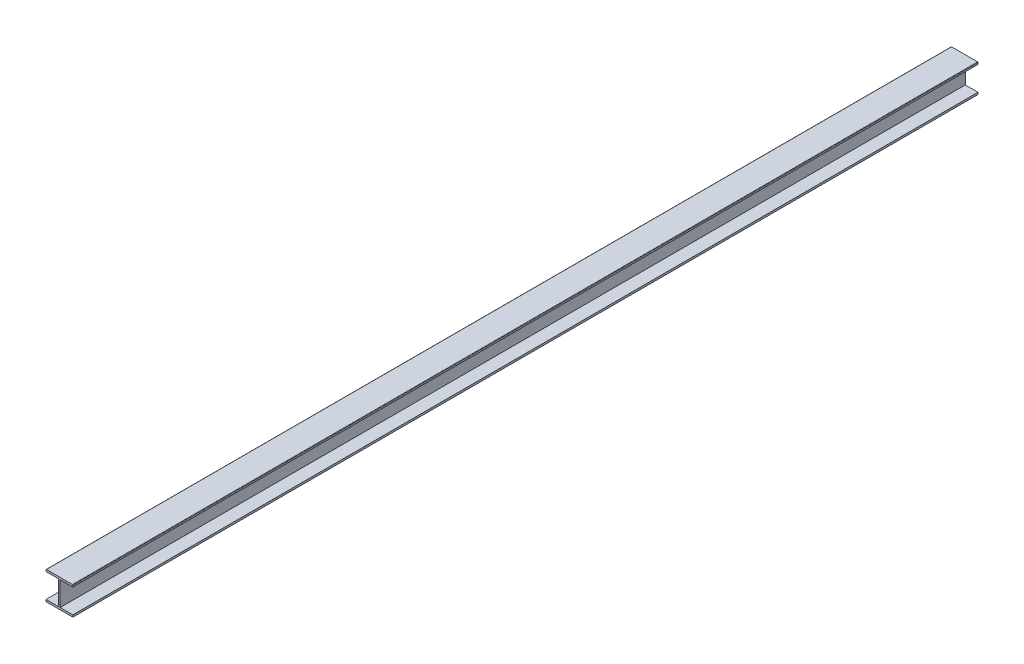
ISO-10303-21;
HEADER;
FILE_DESCRIPTION(('STEP AP214'),'2;1');
FILE_NAME('part.step','',(''),(''),'','','');
FILE_SCHEMA(('AUTOMOTIVE_DESIGN { 1 0 10303 214 1 1 1 1 }'));
ENDSEC;
DATA;
#1=APPLICATION_CONTEXT('core data for automotive mechanical design processes');
#2=APPLICATION_PROTOCOL_DEFINITION('international standard','automotive_design',2000,#1);
#3=PRODUCT_CONTEXT('',#1,'mechanical');
#4=PRODUCT('Part','Part','',(#3));
#5=PRODUCT_RELATED_PRODUCT_CATEGORY('part','',(#4));
#6=PRODUCT_DEFINITION_FORMATION('','',#4);
#7=PRODUCT_DEFINITION_CONTEXT('part definition',#1,'design');
#8=PRODUCT_DEFINITION('design','',#6,#7);
#9=PRODUCT_DEFINITION_SHAPE('','',#8);
#10=(LENGTH_UNIT() NAMED_UNIT(*) SI_UNIT(.MILLI.,.METRE.));
#11=(NAMED_UNIT(*) PLANE_ANGLE_UNIT() SI_UNIT($,.RADIAN.));
#12=(NAMED_UNIT(*) SI_UNIT($,.STERADIAN.) SOLID_ANGLE_UNIT());
#13=UNCERTAINTY_MEASURE_WITH_UNIT(LENGTH_MEASURE(1.E-05),#10,'distance_accuracy_value','');
#14=(GEOMETRIC_REPRESENTATION_CONTEXT(3) GLOBAL_UNCERTAINTY_ASSIGNED_CONTEXT((#13)) GLOBAL_UNIT_ASSIGNED_CONTEXT((#10,
#11,#12)) REPRESENTATION_CONTEXT('',''));
#15=CARTESIAN_POINT('',(0.,0.,0.));
#16=DIRECTION('',(0.,0.,1.));
#17=DIRECTION('',(1.,0.,0.));
#18=AXIS2_PLACEMENT_3D('',#15,#16,#17);
#19=CARTESIAN_POINT('',(154.432,-162.052240532958,5214.4));
#20=DIRECTION('',(0.,1.,0.));
#21=DIRECTION('',(-1.,0.,0.));
#22=AXIS2_PLACEMENT_3D('',#19,#20,#21);
#23=PLANE('',#22);
#24=DIRECTION('',(-1.,0.,0.));
#25=VECTOR('',#24,1.);
#26=CARTESIAN_POINT('',(154.432000000005,-162.052240532958,304.8));
#27=LINE('',#26,#25);
#28=CARTESIAN_POINT('',(154.432,-162.052240532958,304.800000000002));
#29=VERTEX_POINT('',#28);
#30=CARTESIAN_POINT('',(0.,-162.052240532958,304.800000000002));
#31=VERTEX_POINT('',#30);
#32=EDGE_CURVE('E207',#29,#31,#27,.T.);
#33=ORIENTED_EDGE('',*,*,#32,.F.);
#34=DIRECTION('',(0.,0.,-1.));
#35=VECTOR('',#34,1.);
#36=CARTESIAN_POINT('',(154.432,-162.052240532958,5214.4));
#37=LINE('',#36,#35);
#38=CARTESIAN_POINT('',(154.432,-162.052240532958,2454.8));
#39=VERTEX_POINT('',#38);
#40=EDGE_CURVE('E340',#39,#29,#37,.T.);
#41=ORIENTED_EDGE('',*,*,#40,.F.);
#42=DIRECTION('',(1.,0.,0.));
#43=VECTOR('',#42,1.);
#44=CARTESIAN_POINT('',(154.432,-162.052240532958,2454.8));
#45=LINE('',#44,#43);
#46=CARTESIAN_POINT('',(0.,-162.052240532958,2454.8));
#47=VERTEX_POINT('',#46);
#48=EDGE_CURVE('E192',#47,#39,#45,.T.);
#49=ORIENTED_EDGE('',*,*,#48,.F.);
#50=DIRECTION('',(0.,0.,-1.));
#51=VECTOR('',#50,1.);
#52=CARTESIAN_POINT('',(0.,-162.052240532958,5214.4));
#53=LINE('',#52,#51);
#54=EDGE_CURVE('E347',#47,#31,#53,.T.);
#55=ORIENTED_EDGE('',*,*,#54,.T.);
#56=EDGE_LOOP('',(#33,#41,#49,#55));
#57=FACE_BOUND('',#56,.T.);
#58=ADVANCED_FACE('F41',(#57),#23,.F.);
#59=DIRECTION('',(1.,0.,0.));
#60=VECTOR('',#59,1.);
#61=CARTESIAN_POINT('',(154.432,-162.052240532958,4909.6));
#62=LINE('',#61,#60);
#63=CARTESIAN_POINT('',(0.,-162.052240532958,4909.6));
#64=VERTEX_POINT('',#63);
#65=CARTESIAN_POINT('',(154.432,-162.052240532958,4909.6));
#66=VERTEX_POINT('',#65);
#67=EDGE_CURVE('E204',#64,#66,#62,.T.);
#68=ORIENTED_EDGE('',*,*,#67,.F.);
#69=CARTESIAN_POINT('',(0.,-162.052240532958,2759.6));
#70=VERTEX_POINT('',#69);
#71=EDGE_CURVE('E270',#64,#70,#53,.T.);
#72=ORIENTED_EDGE('',*,*,#71,.T.);
#73=DIRECTION('',(-1.,0.,0.));
#74=VECTOR('',#73,1.);
#75=CARTESIAN_POINT('',(154.432,-162.052240532958,2759.6));
#76=LINE('',#75,#74);
#77=CARTESIAN_POINT('',(154.432,-162.052240532958,2759.6));
#78=VERTEX_POINT('',#77);
#79=EDGE_CURVE('E195',#78,#70,#76,.T.);
#80=ORIENTED_EDGE('',*,*,#79,.F.);
#81=EDGE_CURVE('E264',#66,#78,#37,.T.);
#82=ORIENTED_EDGE('',*,*,#81,.F.);
#83=EDGE_LOOP('',(#68,#72,#80,#82));
#84=FACE_BOUND('',#83,.T.);
#85=ADVANCED_FACE('F361',(#84),#23,.F.);
#86=CARTESIAN_POINT('',(0.,-162.052240532958,5214.4));
#87=VERTEX_POINT('',#86);
#88=EDGE_CURVE('E266',#87,#64,#53,.T.);
#89=ORIENTED_EDGE('',*,*,#88,.T.);
#90=ORIENTED_EDGE('',*,*,#67,.T.);
#91=CARTESIAN_POINT('',(154.432,-162.052240532958,5214.4));
#92=VERTEX_POINT('',#91);
#93=EDGE_CURVE('E260',#92,#66,#37,.T.);
#94=ORIENTED_EDGE('',*,*,#93,.F.);
#95=DIRECTION('',(1.,0.,0.));
#96=VECTOR('',#95,1.);
#97=CARTESIAN_POINT('',(154.432,-162.052240532958,5214.4));
#98=LINE('',#97,#96);
#99=EDGE_CURVE('E325',#87,#92,#98,.T.);
#100=ORIENTED_EDGE('',*,*,#99,.F.);
#101=EDGE_LOOP('',(#89,#90,#94,#100));
#102=FACE_BOUND('',#101,.T.);
#103=ADVANCED_FACE('F355',(#102),#23,.F.);
#104=CARTESIAN_POINT('',(154.432,-162.052240532958,0.));
#105=VERTEX_POINT('',#104);
#106=EDGE_CURVE('E259',#29,#105,#37,.T.);
#107=ORIENTED_EDGE('',*,*,#106,.F.);
#108=ORIENTED_EDGE('',*,*,#32,.T.);
#109=CARTESIAN_POINT('',(0.,-162.052240532958,0.));
#110=VERTEX_POINT('',#109);
#111=EDGE_CURVE('E263',#31,#110,#53,.T.);
#112=ORIENTED_EDGE('',*,*,#111,.T.);
#113=DIRECTION('',(1.,0.,0.));
#114=VECTOR('',#113,1.);
#115=CARTESIAN_POINT('',(154.432,-162.052240532958,0.));
#116=LINE('',#115,#114);
#117=EDGE_CURVE('E290',#110,#105,#116,.T.);
#118=ORIENTED_EDGE('',*,*,#117,.T.);
#119=EDGE_LOOP('',(#107,#108,#112,#118));
#120=FACE_BOUND('',#119,.T.);
#121=ADVANCED_FACE('F342',(#120),#23,.F.);
#122=CARTESIAN_POINT('',(0.,-11.5572405329582,5214.4));
#123=DIRECTION('',(1.,0.,0.));
#124=DIRECTION('',(0.,0.,-1.));
#125=AXIS2_PLACEMENT_3D('',#122,#123,#124);
#126=PLANE('',#125);
#127=DIRECTION('',(0.,-1.,0.));
#128=VECTOR('',#127,1.);
#129=CARTESIAN_POINT('',(0.,-11.5572405329582,5214.4));
#130=LINE('',#129,#128);
#131=CARTESIAN_POINT('',(0.,-2.54024053295815,5214.4));
#132=VERTEX_POINT('',#131);
#133=CARTESIAN_POINT('',(0.,-11.5572405329582,5214.4));
#134=VERTEX_POINT('',#133);
#135=EDGE_CURVE('E169',#132,#134,#130,.T.);
#136=ORIENTED_EDGE('',*,*,#135,.F.);
#137=DIRECTION('',(0.,0.,-1.));
#138=VECTOR('',#137,1.);
#139=CARTESIAN_POINT('',(0.,-2.54024053295815,5214.4));
#140=LINE('',#139,#138);
#141=CARTESIAN_POINT('',(0.,-2.54024053295815,0.));
#142=VERTEX_POINT('',#141);
#143=EDGE_CURVE('E11',#132,#142,#140,.T.);
#144=ORIENTED_EDGE('',*,*,#143,.T.);
#145=DIRECTION('',(0.,-1.,0.));
#146=VECTOR('',#145,1.);
#147=CARTESIAN_POINT('',(0.,-11.5572405329582,0.));
#148=LINE('',#147,#146);
#149=CARTESIAN_POINT('',(0.,-11.5572405329582,0.));
#150=VERTEX_POINT('',#149);
#151=EDGE_CURVE('E190',#142,#150,#148,.T.);
#152=ORIENTED_EDGE('',*,*,#151,.T.);
#153=DIRECTION('',(0.,0.,-1.));
#154=VECTOR('',#153,1.);
#155=CARTESIAN_POINT('',(0.,-11.5572405329582,5214.4));
#156=LINE('',#155,#154);
#157=EDGE_CURVE('E182',#134,#150,#156,.T.);
#158=ORIENTED_EDGE('',*,*,#157,.F.);
#159=EDGE_LOOP('',(#136,#144,#152,#158));
#160=FACE_BOUND('',#159,.T.);
#161=ADVANCED_FACE('F188',(#160),#126,.F.);
#162=CARTESIAN_POINT('',(73.152,-11.5572405329581,5214.4));
#163=DIRECTION('',(0.,1.,0.));
#164=DIRECTION('',(-1.,0.,0.));
#165=AXIS2_PLACEMENT_3D('',#162,#163,#164);
#166=PLANE('',#165);
#167=DIRECTION('',(1.,0.,0.));
#168=VECTOR('',#167,1.);
#169=CARTESIAN_POINT('',(73.152,-11.5572405329581,0.));
#170=LINE('',#169,#168);
#171=CARTESIAN_POINT('',(73.152,-11.5572405329581,0.));
#172=VERTEX_POINT('',#171);
#173=EDGE_CURVE('E292',#150,#172,#170,.T.);
#174=ORIENTED_EDGE('',*,*,#173,.T.);
#175=DIRECTION('',(0.,0.,-1.));
#176=VECTOR('',#175,1.);
#177=CARTESIAN_POINT('',(73.152,-11.5572405329581,5214.4));
#178=LINE('',#177,#176);
#179=CARTESIAN_POINT('',(73.152,-11.5572405329581,5214.4));
#180=VERTEX_POINT('',#179);
#181=EDGE_CURVE('E184',#180,#172,#178,.T.);
#182=ORIENTED_EDGE('',*,*,#181,.F.);
#183=DIRECTION('',(1.,0.,0.));
#184=VECTOR('',#183,1.);
#185=CARTESIAN_POINT('',(73.152,-11.5572405329581,5214.4));
#186=LINE('',#185,#184);
#187=EDGE_CURVE('E172',#134,#180,#186,.T.);
#188=ORIENTED_EDGE('',*,*,#187,.F.);
#189=ORIENTED_EDGE('',*,*,#157,.T.);
#190=EDGE_LOOP('',(#174,#182,#188,#189));
#191=FACE_BOUND('',#190,.T.);
#192=ADVANCED_FACE('F181',(#191),#166,.F.);
#193=CARTESIAN_POINT('',(73.152,-150.495240532958,5214.4));
#194=DIRECTION('',(1.,0.,0.));
#195=DIRECTION('',(0.,0.,-1.));
#196=AXIS2_PLACEMENT_3D('',#193,#194,#195);
#197=PLANE('',#196);
#198=DIRECTION('',(0.,-1.,0.));
#199=VECTOR('',#198,1.);
#200=CARTESIAN_POINT('',(73.152,-150.495240532958,0.));
#201=LINE('',#200,#199);
#202=CARTESIAN_POINT('',(73.152,-150.495240532958,0.));
#203=VERTEX_POINT('',#202);
#204=EDGE_CURVE('E285',#172,#203,#201,.T.);
#205=ORIENTED_EDGE('',*,*,#204,.T.);
#206=DIRECTION('',(0.,0.,-1.));
#207=VECTOR('',#206,1.);
#208=CARTESIAN_POINT('',(73.152,-150.495240532958,5214.4));
#209=LINE('',#208,#207);
#210=CARTESIAN_POINT('',(73.152,-150.495240532958,5214.4));
#211=VERTEX_POINT('',#210);
#212=EDGE_CURVE('E197',#211,#203,#209,.T.);
#213=ORIENTED_EDGE('',*,*,#212,.F.);
#214=DIRECTION('',(0.,-1.,0.));
#215=VECTOR('',#214,1.);
#216=CARTESIAN_POINT('',(73.152,-150.495240532958,5214.4));
#217=LINE('',#216,#215);
#218=EDGE_CURVE('E186',#180,#211,#217,.T.);
#219=ORIENTED_EDGE('',*,*,#218,.F.);
#220=ORIENTED_EDGE('',*,*,#181,.T.);
#221=EDGE_LOOP('',(#205,#213,#219,#220));
#222=FACE_BOUND('',#221,.T.);
#223=ADVANCED_FACE('F319',(#222),#197,.F.);
#224=CARTESIAN_POINT('',(0.,-150.495240532958,5214.4));
#225=DIRECTION('',(0.,-1.,0.));
#226=DIRECTION('',(1.,0.,0.));
#227=AXIS2_PLACEMENT_3D('',#224,#225,#226);
#228=PLANE('',#227);
#229=DIRECTION('',(-1.,0.,0.));
#230=VECTOR('',#229,1.);
#231=CARTESIAN_POINT('',(0.,-150.495240532958,0.));
#232=LINE('',#231,#230);
#233=CARTESIAN_POINT('',(0.,-150.495240532958,0.));
#234=VERTEX_POINT('',#233);
#235=EDGE_CURVE('E280',#203,#234,#232,.T.);
#236=ORIENTED_EDGE('',*,*,#235,.T.);
#237=DIRECTION('',(0.,0.,-1.));
#238=VECTOR('',#237,1.);
#239=CARTESIAN_POINT('',(0.,-150.495240532958,5214.4));
#240=LINE('',#239,#238);
#241=CARTESIAN_POINT('',(0.,-150.495240532958,5214.4));
#242=VERTEX_POINT('',#241);
#243=EDGE_CURVE('E269',#242,#234,#240,.T.);
#244=ORIENTED_EDGE('',*,*,#243,.F.);
#245=DIRECTION('',(-1.,0.,0.));
#246=VECTOR('',#245,1.);
#247=CARTESIAN_POINT('',(0.,-150.495240532958,5214.4));
#248=LINE('',#247,#246);
#249=EDGE_CURVE('E281',#211,#242,#248,.T.);
#250=ORIENTED_EDGE('',*,*,#249,.F.);
#251=ORIENTED_EDGE('',*,*,#212,.T.);
#252=EDGE_LOOP('',(#236,#244,#250,#251));
#253=FACE_BOUND('',#252,.T.);
#254=ADVANCED_FACE('F278',(#253),#228,.F.);
#255=CARTESIAN_POINT('',(0.,-162.052240532958,5214.4));
#256=DIRECTION('',(1.,0.,0.));
#257=DIRECTION('',(0.,1.,0.));
#258=AXIS2_PLACEMENT_3D('',#255,#256,#257);
#259=PLANE('',#258);
#260=DIRECTION('',(0.,-1.,0.));
#261=VECTOR('',#260,1.);
#262=CARTESIAN_POINT('',(0.,-162.052240532958,0.));
#263=LINE('',#262,#261);
#264=EDGE_CURVE('E288',#234,#110,#263,.T.);
#265=ORIENTED_EDGE('',*,*,#264,.T.);
#266=ORIENTED_EDGE('',*,*,#111,.F.);
#267=ORIENTED_EDGE('',*,*,#54,.F.);
#268=EDGE_CURVE('E271',#70,#47,#53,.T.);
#269=ORIENTED_EDGE('',*,*,#268,.F.);
#270=ORIENTED_EDGE('',*,*,#71,.F.);
#271=ORIENTED_EDGE('',*,*,#88,.F.);
#272=DIRECTION('',(0.,-1.,0.));
#273=VECTOR('',#272,1.);
#274=CARTESIAN_POINT('',(0.,-162.052240532958,5214.4));
#275=LINE('',#274,#273);
#276=EDGE_CURVE('E321',#242,#87,#275,.T.);
#277=ORIENTED_EDGE('',*,*,#276,.F.);
#278=ORIENTED_EDGE('',*,*,#243,.T.);
#279=EDGE_LOOP('',(#265,#266,#267,#269,#270,#271,#277,#278));
#280=FACE_BOUND('',#279,.T.);
#281=ADVANCED_FACE('F348',(#280),#259,.F.);
#282=CARTESIAN_POINT('',(154.432,-162.052240532958,2607.2));
#283=VERTEX_POINT('',#282);
#284=EDGE_CURVE('E265',#78,#283,#37,.T.);
#285=ORIENTED_EDGE('',*,*,#284,.F.);
#286=ORIENTED_EDGE('',*,*,#79,.T.);
#287=ORIENTED_EDGE('',*,*,#268,.T.);
#288=ORIENTED_EDGE('',*,*,#48,.T.);
#289=EDGE_CURVE('E366',#283,#39,#37,.T.);
#290=ORIENTED_EDGE('',*,*,#289,.F.);
#291=EDGE_LOOP('',(#285,#286,#287,#288,#290));
#292=FACE_BOUND('',#291,.T.);
#293=ADVANCED_FACE('F365',(#292),#23,.F.);
#294=CARTESIAN_POINT('',(154.432,-150.495240532958,5214.4));
#295=DIRECTION('',(-1.,0.,0.));
#296=DIRECTION('',(0.,0.,1.));
#297=AXIS2_PLACEMENT_3D('',#294,#295,#296);
#298=PLANE('',#297);
#299=DIRECTION('',(0.,1.,0.));
#300=VECTOR('',#299,1.);
#301=CARTESIAN_POINT('',(154.432,-150.495240532958,0.));
#302=LINE('',#301,#300);
#303=CARTESIAN_POINT('',(154.432,-150.495240532958,0.));
#304=VERTEX_POINT('',#303);
#305=EDGE_CURVE('E298',#105,#304,#302,.T.);
#306=ORIENTED_EDGE('',*,*,#305,.T.);
#307=DIRECTION('',(0.,0.,-1.));
#308=VECTOR('',#307,1.);
#309=CARTESIAN_POINT('',(154.432,-150.495240532958,5214.4));
#310=LINE('',#309,#308);
#311=CARTESIAN_POINT('',(154.432,-150.495240532958,5214.4));
#312=VERTEX_POINT('',#311);
#313=EDGE_CURVE('E256',#312,#304,#310,.T.);
#314=ORIENTED_EDGE('',*,*,#313,.F.);
#315=DIRECTION('',(0.,1.,0.));
#316=VECTOR('',#315,1.);
#317=CARTESIAN_POINT('',(154.432,-150.495240532958,5214.4));
#318=LINE('',#317,#316);
#319=EDGE_CURVE('E327',#92,#312,#318,.T.);
#320=ORIENTED_EDGE('',*,*,#319,.F.);
#321=ORIENTED_EDGE('',*,*,#93,.T.);
#322=ORIENTED_EDGE('',*,*,#81,.T.);
#323=ORIENTED_EDGE('',*,*,#284,.T.);
#324=ORIENTED_EDGE('',*,*,#289,.T.);
#325=ORIENTED_EDGE('',*,*,#40,.T.);
#326=ORIENTED_EDGE('',*,*,#106,.T.);
#327=EDGE_LOOP('',(#306,#314,#320,#321,#322,#323,#324,#325,#326));
#328=FACE_BOUND('',#327,.T.);
#329=ADVANCED_FACE('F335',(#328),#298,.F.);
#330=CARTESIAN_POINT('',(81.28,-150.495240532958,5214.4));
#331=DIRECTION('',(0.,-1.,0.));
#332=DIRECTION('',(1.,0.,0.));
#333=AXIS2_PLACEMENT_3D('',#330,#331,#332);
#334=PLANE('',#333);
#335=DIRECTION('',(-1.,0.,0.));
#336=VECTOR('',#335,1.);
#337=CARTESIAN_POINT('',(81.28,-150.495240532958,0.));
#338=LINE('',#337,#336);
#339=CARTESIAN_POINT('',(81.28,-150.495240532958,0.));
#340=VERTEX_POINT('',#339);
#341=EDGE_CURVE('E300',#304,#340,#338,.T.);
#342=ORIENTED_EDGE('',*,*,#341,.T.);
#343=DIRECTION('',(0.,0.,-1.));
#344=VECTOR('',#343,1.);
#345=CARTESIAN_POINT('',(81.28,-150.495240532958,5214.4));
#346=LINE('',#345,#344);
#347=CARTESIAN_POINT('',(81.28,-150.495240532958,5214.4));
#348=VERTEX_POINT('',#347);
#349=EDGE_CURVE('E253',#348,#340,#346,.T.);
#350=ORIENTED_EDGE('',*,*,#349,.F.);
#351=DIRECTION('',(-1.,0.,0.));
#352=VECTOR('',#351,1.);
#353=CARTESIAN_POINT('',(81.28,-150.495240532958,5214.4));
#354=LINE('',#353,#352);
#355=EDGE_CURVE('E315',#312,#348,#354,.T.);
#356=ORIENTED_EDGE('',*,*,#355,.F.);
#357=ORIENTED_EDGE('',*,*,#313,.T.);
#358=EDGE_LOOP('',(#342,#350,#356,#357));
#359=FACE_BOUND('',#358,.T.);
#360=ADVANCED_FACE('F332',(#359),#334,.F.);
#361=CARTESIAN_POINT('',(81.28,-11.5572405329582,5214.4));
#362=DIRECTION('',(-1.,0.,0.));
#363=DIRECTION('',(0.,-1.,0.));
#364=AXIS2_PLACEMENT_3D('',#361,#362,#363);
#365=PLANE('',#364);
#366=DIRECTION('',(0.,1.,0.));
#367=VECTOR('',#366,1.);
#368=CARTESIAN_POINT('',(81.28,-11.5572405329582,0.));
#369=LINE('',#368,#367);
#370=CARTESIAN_POINT('',(81.28,-11.5572405329582,0.));
#371=VERTEX_POINT('',#370);
#372=EDGE_CURVE('E245',#340,#371,#369,.T.);
#373=ORIENTED_EDGE('',*,*,#372,.T.);
#374=DIRECTION('',(0.,0.,-1.));
#375=VECTOR('',#374,1.);
#376=CARTESIAN_POINT('',(81.28,-11.5572405329582,5214.4));
#377=LINE('',#376,#375);
#378=CARTESIAN_POINT('',(81.28,-11.5572405329582,5214.4));
#379=VERTEX_POINT('',#378);
#380=EDGE_CURVE('E250',#379,#371,#377,.T.);
#381=ORIENTED_EDGE('',*,*,#380,.F.);
#382=DIRECTION('',(0.,1.,0.));
#383=VECTOR('',#382,1.);
#384=CARTESIAN_POINT('',(81.28,-11.5572405329582,5214.4));
#385=LINE('',#384,#383);
#386=EDGE_CURVE('E312',#348,#379,#385,.T.);
#387=ORIENTED_EDGE('',*,*,#386,.F.);
#388=ORIENTED_EDGE('',*,*,#349,.T.);
#389=EDGE_LOOP('',(#373,#381,#387,#388));
#390=FACE_BOUND('',#389,.T.);
#391=ADVANCED_FACE('F304',(#390),#365,.F.);
#392=CARTESIAN_POINT('',(154.432,-11.5572405329581,5214.4));
#393=DIRECTION('',(0.,1.,0.));
#394=DIRECTION('',(-1.,0.,0.));
#395=AXIS2_PLACEMENT_3D('',#392,#393,#394);
#396=PLANE('',#395);
#397=DIRECTION('',(1.,0.,0.));
#398=VECTOR('',#397,1.);
#399=CARTESIAN_POINT('',(154.432,-11.5572405329581,0.));
#400=LINE('',#399,#398);
#401=CARTESIAN_POINT('',(154.432,-11.5572405329581,0.));
#402=VERTEX_POINT('',#401);
#403=EDGE_CURVE('E242',#371,#402,#400,.T.);
#404=ORIENTED_EDGE('',*,*,#403,.T.);
#405=DIRECTION('',(0.,0.,-1.));
#406=VECTOR('',#405,1.);
#407=CARTESIAN_POINT('',(154.432,-11.5572405329581,5214.4));
#408=LINE('',#407,#406);
#409=CARTESIAN_POINT('',(154.432,-11.5572405329581,5214.4));
#410=VERTEX_POINT('',#409);
#411=EDGE_CURVE('E231',#410,#402,#408,.T.);
#412=ORIENTED_EDGE('',*,*,#411,.F.);
#413=DIRECTION('',(1.,0.,0.));
#414=VECTOR('',#413,1.);
#415=CARTESIAN_POINT('',(154.432,-11.5572405329581,5214.4));
#416=LINE('',#415,#414);
#417=EDGE_CURVE('E311',#379,#410,#416,.T.);
#418=ORIENTED_EDGE('',*,*,#417,.F.);
#419=ORIENTED_EDGE('',*,*,#380,.T.);
#420=EDGE_LOOP('',(#404,#412,#418,#419));
#421=FACE_BOUND('',#420,.T.);
#422=ADVANCED_FACE('F310',(#421),#396,.F.);
#423=CARTESIAN_POINT('',(154.432,-0.000240532958131285,5214.4));
#424=DIRECTION('',(-1.,0.,0.));
#425=DIRECTION('',(0.,0.,1.));
#426=AXIS2_PLACEMENT_3D('',#423,#424,#425);
#427=PLANE('',#426);
#428=DIRECTION('',(0.,1.,0.));
#429=VECTOR('',#428,1.);
#430=CARTESIAN_POINT('',(154.432,-0.000240532958131285,0.));
#431=LINE('',#430,#429);
#432=CARTESIAN_POINT('',(154.432,-2.54024053295813,0.));
#433=VERTEX_POINT('',#432);
#434=EDGE_CURVE('E238',#402,#433,#431,.T.);
#435=ORIENTED_EDGE('',*,*,#434,.T.);
#436=DIRECTION('',(0.,0.,-1.));
#437=VECTOR('',#436,1.);
#438=CARTESIAN_POINT('',(154.432,-2.54024053295813,5214.4));
#439=LINE('',#438,#437);
#440=CARTESIAN_POINT('',(154.432,-2.54024053295813,5214.4));
#441=VERTEX_POINT('',#440);
#442=EDGE_CURVE('E64',#433,#441,#439,.F.);
#443=ORIENTED_EDGE('',*,*,#442,.T.);
#444=DIRECTION('',(0.,1.,0.));
#445=VECTOR('',#444,1.);
#446=CARTESIAN_POINT('',(154.432,-0.000240532958131285,5214.4));
#447=LINE('',#446,#445);
#448=EDGE_CURVE('E223',#410,#441,#447,.T.);
#449=ORIENTED_EDGE('',*,*,#448,.F.);
#450=ORIENTED_EDGE('',*,*,#411,.T.);
#451=EDGE_LOOP('',(#435,#443,#449,#450));
#452=FACE_BOUND('',#451,.T.);
#453=ADVANCED_FACE('F240',(#452),#427,.F.);
#454=CARTESIAN_POINT('',(0.,-0.000240532958150197,5214.4));
#455=DIRECTION('',(0.,-1.,0.));
#456=DIRECTION('',(1.,0.,0.));
#457=AXIS2_PLACEMENT_3D('',#454,#455,#456);
#458=PLANE('',#457);
#459=DIRECTION('',(-1.,0.,0.));
#460=VECTOR('',#459,1.);
#461=CARTESIAN_POINT('',(0.,-0.000240532958150197,5214.4));
#462=LINE('',#461,#460);
#463=CARTESIAN_POINT('',(151.892,-0.000240532958131596,5214.4));
#464=VERTEX_POINT('',#463);
#465=CARTESIAN_POINT('',(2.54,-0.000240532958149886,5214.4));
#466=VERTEX_POINT('',#465);
#467=EDGE_CURVE('E222',#464,#466,#462,.T.);
#468=ORIENTED_EDGE('',*,*,#467,.F.);
#469=DIRECTION('',(0.,0.,-1.));
#470=VECTOR('',#469,1.);
#471=CARTESIAN_POINT('',(151.892,-0.000240532958131596,5214.4));
#472=LINE('',#471,#470);
#473=CARTESIAN_POINT('',(151.892,-0.000240532958131596,0.));
#474=VERTEX_POINT('',#473);
#475=EDGE_CURVE('E212',#464,#474,#472,.T.);
#476=ORIENTED_EDGE('',*,*,#475,.T.);
#477=DIRECTION('',(-1.,0.,0.));
#478=VECTOR('',#477,1.);
#479=CARTESIAN_POINT('',(0.,-0.000240532958150197,0.));
#480=LINE('',#479,#478);
#481=CARTESIAN_POINT('',(2.54,-0.000240532958149886,0.));
#482=VERTEX_POINT('',#481);
#483=EDGE_CURVE('E177',#474,#482,#480,.T.);
#484=ORIENTED_EDGE('',*,*,#483,.T.);
#485=DIRECTION('',(0.,0.,-1.));
#486=VECTOR('',#485,1.);
#487=CARTESIAN_POINT('',(2.54,-0.000240532958149886,5214.4));
#488=LINE('',#487,#486);
#489=EDGE_CURVE('E210',#482,#466,#488,.F.);
#490=ORIENTED_EDGE('',*,*,#489,.T.);
#491=EDGE_LOOP('',(#468,#476,#484,#490));
#492=FACE_BOUND('',#491,.T.);
#493=ADVANCED_FACE('F227',(#492),#458,.F.);
#494=CARTESIAN_POINT('',(0.,0.,5214.4));
#495=DIRECTION('',(0.,0.,-1.));
#496=DIRECTION('',(-1.,0.,0.));
#497=AXIS2_PLACEMENT_3D('',#494,#495,#496);
#498=PLANE('',#497);
#499=ORIENTED_EDGE('',*,*,#448,.T.);
#500=CARTESIAN_POINT('',(151.892,-2.54024053295813,5214.4));
#501=DIRECTION('',(0.,0.,-1.));
#502=DIRECTION('',(-1.,0.,0.));
#503=AXIS2_PLACEMENT_3D('',#500,#501,#502);
#504=CIRCLE('',#503,2.54);
#505=EDGE_CURVE('E49',#441,#464,#504,.F.);
#506=ORIENTED_EDGE('',*,*,#505,.T.);
#507=ORIENTED_EDGE('',*,*,#467,.T.);
#508=CARTESIAN_POINT('',(2.54,-2.54024053295815,5214.4));
#509=DIRECTION('',(0.,0.,-1.));
#510=DIRECTION('',(-1.,0.,0.));
#511=AXIS2_PLACEMENT_3D('',#508,#509,#510);
#512=CIRCLE('',#511,2.54);
#513=EDGE_CURVE('E56',#466,#132,#512,.F.);
#514=ORIENTED_EDGE('',*,*,#513,.T.);
#515=ORIENTED_EDGE('',*,*,#135,.T.);
#516=ORIENTED_EDGE('',*,*,#187,.T.);
#517=ORIENTED_EDGE('',*,*,#218,.T.);
#518=ORIENTED_EDGE('',*,*,#249,.T.);
#519=ORIENTED_EDGE('',*,*,#276,.T.);
#520=ORIENTED_EDGE('',*,*,#99,.T.);
#521=ORIENTED_EDGE('',*,*,#319,.T.);
#522=ORIENTED_EDGE('',*,*,#355,.T.);
#523=ORIENTED_EDGE('',*,*,#386,.T.);
#524=ORIENTED_EDGE('',*,*,#417,.T.);
#525=EDGE_LOOP('',(#499,#506,#507,#514,#515,#516,#517,#518,#519,#520,#521,#522,#523,#524));
#526=FACE_BOUND('',#525,.T.);
#527=ADVANCED_FACE('F171',(#526),#498,.F.);
#528=CARTESIAN_POINT('',(0.,0.,0.));
#529=DIRECTION('',(0.,0.,-1.));
#530=DIRECTION('',(-1.,0.,0.));
#531=AXIS2_PLACEMENT_3D('',#528,#529,#530);
#532=PLANE('',#531);
#533=ORIENTED_EDGE('',*,*,#483,.F.);
#534=CARTESIAN_POINT('',(151.892,-2.54024053295813,0.));
#535=DIRECTION('',(0.,0.,-1.));
#536=DIRECTION('',(-1.,0.,0.));
#537=AXIS2_PLACEMENT_3D('',#534,#535,#536);
#538=CIRCLE('',#537,2.54);
#539=EDGE_CURVE('E217',#474,#433,#538,.T.);
#540=ORIENTED_EDGE('',*,*,#539,.T.);
#541=ORIENTED_EDGE('',*,*,#434,.F.);
#542=ORIENTED_EDGE('',*,*,#403,.F.);
#543=ORIENTED_EDGE('',*,*,#372,.F.);
#544=ORIENTED_EDGE('',*,*,#341,.F.);
#545=ORIENTED_EDGE('',*,*,#305,.F.);
#546=ORIENTED_EDGE('',*,*,#117,.F.);
#547=ORIENTED_EDGE('',*,*,#264,.F.);
#548=ORIENTED_EDGE('',*,*,#235,.F.);
#549=ORIENTED_EDGE('',*,*,#204,.F.);
#550=ORIENTED_EDGE('',*,*,#173,.F.);
#551=ORIENTED_EDGE('',*,*,#151,.F.);
#552=CARTESIAN_POINT('',(2.54,-2.54024053295815,0.));
#553=DIRECTION('',(0.,0.,-1.));
#554=DIRECTION('',(-1.,0.,0.));
#555=AXIS2_PLACEMENT_3D('',#552,#553,#554);
#556=CIRCLE('',#555,2.54);
#557=EDGE_CURVE('E215',#142,#482,#556,.T.);
#558=ORIENTED_EDGE('',*,*,#557,.T.);
#559=EDGE_LOOP('',(#533,#540,#541,#542,#543,#544,#545,#546,#547,#548,#549,#550,#551,#558));
#560=FACE_BOUND('',#559,.T.);
#561=ADVANCED_FACE('F236',(#560),#532,.T.);
#562=CARTESIAN_POINT('',(151.892,-2.54024053295813,5214.4));
#563=DIRECTION('',(0.,0.,-1.));
#564=DIRECTION('',(-1.,0.,0.));
#565=AXIS2_PLACEMENT_3D('',#562,#563,#564);
#566=CYLINDRICAL_SURFACE('',#565,2.54);
#567=ORIENTED_EDGE('',*,*,#505,.F.);
#568=ORIENTED_EDGE('',*,*,#442,.F.);
#569=ORIENTED_EDGE('',*,*,#539,.F.);
#570=ORIENTED_EDGE('',*,*,#475,.F.);
#571=EDGE_LOOP('',(#567,#568,#569,#570));
#572=FACE_BOUND('',#571,.T.);
#573=ADVANCED_FACE('F233',(#572),#566,.T.);
#574=CARTESIAN_POINT('',(2.54,-2.54024053295815,5214.4));
#575=DIRECTION('',(0.,0.,-1.));
#576=DIRECTION('',(-1.,0.,0.));
#577=AXIS2_PLACEMENT_3D('',#574,#575,#576);
#578=CYLINDRICAL_SURFACE('',#577,2.54);
#579=ORIENTED_EDGE('',*,*,#513,.F.);
#580=ORIENTED_EDGE('',*,*,#489,.F.);
#581=ORIENTED_EDGE('',*,*,#557,.F.);
#582=ORIENTED_EDGE('',*,*,#143,.F.);
#583=EDGE_LOOP('',(#579,#580,#581,#582));
#584=FACE_BOUND('',#583,.T.);
#585=ADVANCED_FACE('F43',(#584),#578,.T.);
#586=CLOSED_SHELL('',(#58,#85,#103,#121,#161,#192,#223,#254,#281,#293,#329,#360,#391,#422,#453,
#493,#527,#561,#573,#585));
#587=MANIFOLD_SOLID_BREP('B2',#586);
#588=ADVANCED_BREP_SHAPE_REPRESENTATION('',(#18,#587),#14);
#589=SHAPE_DEFINITION_REPRESENTATION(#9,#588);
ENDSEC;
END-ISO-10303-21;
